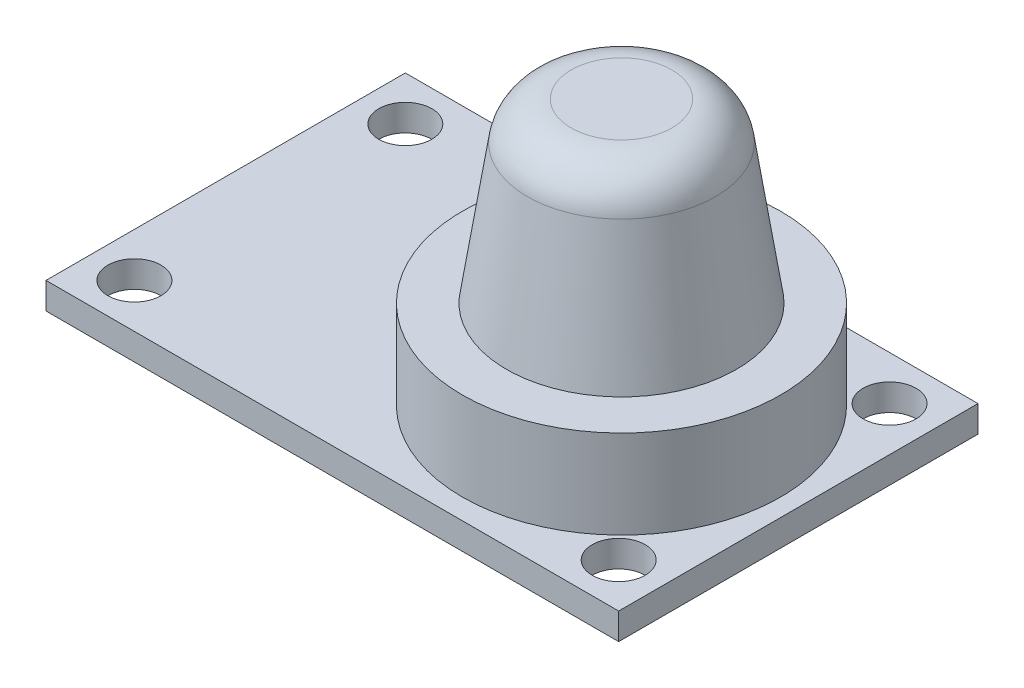
ISO-10303-21;
HEADER;
FILE_DESCRIPTION(('STEP AP214'),'2;1');
FILE_NAME('part.step','',(''),(''),'','','');
FILE_SCHEMA(('AUTOMOTIVE_DESIGN { 1 0 10303 214 1 1 1 1 }'));
ENDSEC;
DATA;
#1=APPLICATION_CONTEXT('core data for automotive mechanical design processes');
#2=APPLICATION_PROTOCOL_DEFINITION('international standard','automotive_design',2000,#1);
#3=PRODUCT_CONTEXT('',#1,'mechanical');
#4=PRODUCT('Part','Part','',(#3));
#5=PRODUCT_RELATED_PRODUCT_CATEGORY('part','',(#4));
#6=PRODUCT_DEFINITION_FORMATION('','',#4);
#7=PRODUCT_DEFINITION_CONTEXT('part definition',#1,'design');
#8=PRODUCT_DEFINITION('design','',#6,#7);
#9=PRODUCT_DEFINITION_SHAPE('','',#8);
#10=(LENGTH_UNIT() NAMED_UNIT(*) SI_UNIT(.MILLI.,.METRE.));
#11=(NAMED_UNIT(*) PLANE_ANGLE_UNIT() SI_UNIT($,.RADIAN.));
#12=(NAMED_UNIT(*) SI_UNIT($,.STERADIAN.) SOLID_ANGLE_UNIT());
#13=UNCERTAINTY_MEASURE_WITH_UNIT(LENGTH_MEASURE(1.E-05),#10,'distance_accuracy_value','');
#14=(GEOMETRIC_REPRESENTATION_CONTEXT(3) GLOBAL_UNCERTAINTY_ASSIGNED_CONTEXT((#13)) GLOBAL_UNIT_ASSIGNED_CONTEXT((#10,
#11,#12)) REPRESENTATION_CONTEXT('',''));
#15=CARTESIAN_POINT('',(0.,0.,0.));
#16=DIRECTION('',(0.,0.,1.));
#17=DIRECTION('',(1.,0.,0.));
#18=AXIS2_PLACEMENT_3D('',#15,#16,#17);
#19=CARTESIAN_POINT('',(0.,1.5,0.));
#20=DIRECTION('',(0.,1.,0.));
#21=DIRECTION('',(0.,0.,1.));
#22=AXIS2_PLACEMENT_3D('',#19,#20,#21);
#23=PLANE('',#22);
#24=CARTESIAN_POINT('',(6.19250000000001,1.5,0.));
#25=DIRECTION('',(0.,1.,0.));
#26=DIRECTION('',(0.,0.,1.));
#27=AXIS2_PLACEMENT_3D('',#24,#25,#26);
#28=CIRCLE('',#27,9.);
#29=CARTESIAN_POINT('',(6.19250000000001,1.5,9.));
#30=VERTEX_POINT('',#29);
#31=EDGE_CURVE('E11',#30,#30,#28,.T.);
#32=ORIENTED_EDGE('',*,*,#31,.F.);
#33=EDGE_LOOP('',(#32));
#34=FACE_BOUND('',#33,.T.);
#35=CARTESIAN_POINT('',(13.6925,1.5,7.66));
#36=DIRECTION('',(0.,1.,0.));
#37=DIRECTION('',(0.,0.,1.));
#38=AXIS2_PLACEMENT_3D('',#35,#36,#37);
#39=CIRCLE('',#38,1.5);
#40=CARTESIAN_POINT('',(13.6925,1.5,9.16));
#41=VERTEX_POINT('',#40);
#42=EDGE_CURVE('E124',#41,#41,#39,.T.);
#43=ORIENTED_EDGE('',*,*,#42,.F.);
#44=EDGE_LOOP('',(#43));
#45=FACE_BOUND('',#44,.T.);
#46=CARTESIAN_POINT('',(-13.6925,1.5,-7.66));
#47=DIRECTION('',(0.,1.,0.));
#48=DIRECTION('',(0.,0.,1.));
#49=AXIS2_PLACEMENT_3D('',#46,#47,#48);
#50=CIRCLE('',#49,1.5);
#51=CARTESIAN_POINT('',(-13.6925,1.5,-6.16));
#52=VERTEX_POINT('',#51);
#53=EDGE_CURVE('E103',#52,#52,#50,.T.);
#54=ORIENTED_EDGE('',*,*,#53,.F.);
#55=EDGE_LOOP('',(#54));
#56=FACE_BOUND('',#55,.T.);
#57=DIRECTION('',(0.,0.,-1.));
#58=VECTOR('',#57,1.);
#59=CARTESIAN_POINT('',(16.1925,1.5,-10.16));
#60=LINE('',#59,#58);
#61=CARTESIAN_POINT('',(16.1925,1.5,10.16));
#62=VERTEX_POINT('',#61);
#63=CARTESIAN_POINT('',(16.1925,1.5,-10.16));
#64=VERTEX_POINT('',#63);
#65=EDGE_CURVE('E87',#62,#64,#60,.T.);
#66=ORIENTED_EDGE('',*,*,#65,.T.);
#67=DIRECTION('',(-1.,0.,0.));
#68=VECTOR('',#67,1.);
#69=CARTESIAN_POINT('',(-16.1925,1.5,-10.16));
#70=LINE('',#69,#68);
#71=CARTESIAN_POINT('',(-16.1925,1.5,-10.16));
#72=VERTEX_POINT('',#71);
#73=EDGE_CURVE('E82',#64,#72,#70,.T.);
#74=ORIENTED_EDGE('',*,*,#73,.T.);
#75=DIRECTION('',(0.,0.,1.));
#76=VECTOR('',#75,1.);
#77=CARTESIAN_POINT('',(-16.1925,1.5,-10.16));
#78=LINE('',#77,#76);
#79=CARTESIAN_POINT('',(-16.1925,1.5,10.16));
#80=VERTEX_POINT('',#79);
#81=EDGE_CURVE('E85',#72,#80,#78,.T.);
#82=ORIENTED_EDGE('',*,*,#81,.T.);
#83=DIRECTION('',(1.,0.,0.));
#84=VECTOR('',#83,1.);
#85=CARTESIAN_POINT('',(-16.1925,1.5,10.16));
#86=LINE('',#85,#84);
#87=EDGE_CURVE('E51',#80,#62,#86,.T.);
#88=ORIENTED_EDGE('',*,*,#87,.T.);
#89=EDGE_LOOP('',(#66,#74,#82,#88));
#90=FACE_BOUND('',#89,.T.);
#91=CARTESIAN_POINT('',(13.6925,1.5,-7.66));
#92=DIRECTION('',(0.,1.,0.));
#93=DIRECTION('',(0.,0.,-1.));
#94=AXIS2_PLACEMENT_3D('',#91,#92,#93);
#95=CIRCLE('',#94,1.5);
#96=CARTESIAN_POINT('',(13.6925,1.5,-9.16));
#97=VERTEX_POINT('',#96);
#98=EDGE_CURVE('E118',#97,#97,#95,.T.);
#99=ORIENTED_EDGE('',*,*,#98,.F.);
#100=EDGE_LOOP('',(#99));
#101=FACE_BOUND('',#100,.T.);
#102=CARTESIAN_POINT('',(-13.6925,1.5,7.66));
#103=DIRECTION('',(0.,1.,0.));
#104=DIRECTION('',(0.,0.,-1.));
#105=AXIS2_PLACEMENT_3D('',#102,#103,#104);
#106=CIRCLE('',#105,1.5);
#107=CARTESIAN_POINT('',(-13.6925,1.5,6.16));
#108=VERTEX_POINT('',#107);
#109=EDGE_CURVE('E130',#108,#108,#106,.T.);
#110=ORIENTED_EDGE('',*,*,#109,.F.);
#111=EDGE_LOOP('',(#110));
#112=FACE_BOUND('',#111,.T.);
#113=ADVANCED_FACE('F33',(#34,#45,#56,#90,#101,#112),#23,.T.);
#114=CARTESIAN_POINT('',(0.,0.,0.));
#115=DIRECTION('',(0.,1.,0.));
#116=DIRECTION('',(0.,0.,1.));
#117=AXIS2_PLACEMENT_3D('',#114,#115,#116);
#118=PLANE('',#117);
#119=DIRECTION('',(0.,0.,-1.));
#120=VECTOR('',#119,1.);
#121=CARTESIAN_POINT('',(16.1925,0.,-10.16));
#122=LINE('',#121,#120);
#123=CARTESIAN_POINT('',(16.1925,0.,10.16));
#124=VERTEX_POINT('',#123);
#125=CARTESIAN_POINT('',(16.1925,0.,-10.16));
#126=VERTEX_POINT('',#125);
#127=EDGE_CURVE('E100',#124,#126,#122,.T.);
#128=ORIENTED_EDGE('',*,*,#127,.F.);
#129=DIRECTION('',(1.,0.,0.));
#130=VECTOR('',#129,1.);
#131=CARTESIAN_POINT('',(-16.1925,0.,10.16));
#132=LINE('',#131,#130);
#133=CARTESIAN_POINT('',(-16.1925,0.,10.16));
#134=VERTEX_POINT('',#133);
#135=EDGE_CURVE('E74',#134,#124,#132,.T.);
#136=ORIENTED_EDGE('',*,*,#135,.F.);
#137=DIRECTION('',(0.,0.,1.));
#138=VECTOR('',#137,1.);
#139=CARTESIAN_POINT('',(-16.1925,0.,-10.16));
#140=LINE('',#139,#138);
#141=CARTESIAN_POINT('',(-16.1925,0.,-10.16));
#142=VERTEX_POINT('',#141);
#143=EDGE_CURVE('E68',#142,#134,#140,.T.);
#144=ORIENTED_EDGE('',*,*,#143,.F.);
#145=DIRECTION('',(-1.,0.,0.));
#146=VECTOR('',#145,1.);
#147=CARTESIAN_POINT('',(-16.1925,0.,-10.16));
#148=LINE('',#147,#146);
#149=EDGE_CURVE('E92',#126,#142,#148,.T.);
#150=ORIENTED_EDGE('',*,*,#149,.F.);
#151=EDGE_LOOP('',(#128,#136,#144,#150));
#152=FACE_BOUND('',#151,.T.);
#153=CARTESIAN_POINT('',(-13.6925,0.,-7.66));
#154=DIRECTION('',(0.,1.,0.));
#155=DIRECTION('',(0.,0.,1.));
#156=AXIS2_PLACEMENT_3D('',#153,#154,#155);
#157=CIRCLE('',#156,1.5);
#158=CARTESIAN_POINT('',(-13.6925,0.,-6.16));
#159=VERTEX_POINT('',#158);
#160=EDGE_CURVE('E115',#159,#159,#157,.T.);
#161=ORIENTED_EDGE('',*,*,#160,.T.);
#162=EDGE_LOOP('',(#161));
#163=FACE_BOUND('',#162,.T.);
#164=CARTESIAN_POINT('',(13.6925,0.,-7.66));
#165=DIRECTION('',(0.,1.,0.));
#166=DIRECTION('',(0.,0.,-1.));
#167=AXIS2_PLACEMENT_3D('',#164,#165,#166);
#168=CIRCLE('',#167,1.5);
#169=CARTESIAN_POINT('',(13.6925,0.,-9.16));
#170=VERTEX_POINT('',#169);
#171=EDGE_CURVE('E121',#170,#170,#168,.T.);
#172=ORIENTED_EDGE('',*,*,#171,.T.);
#173=EDGE_LOOP('',(#172));
#174=FACE_BOUND('',#173,.T.);
#175=CARTESIAN_POINT('',(13.6925,0.,7.66));
#176=DIRECTION('',(0.,1.,0.));
#177=DIRECTION('',(0.,0.,1.));
#178=AXIS2_PLACEMENT_3D('',#175,#176,#177);
#179=CIRCLE('',#178,1.5);
#180=CARTESIAN_POINT('',(13.6925,0.,9.16));
#181=VERTEX_POINT('',#180);
#182=EDGE_CURVE('E127',#181,#181,#179,.T.);
#183=ORIENTED_EDGE('',*,*,#182,.T.);
#184=EDGE_LOOP('',(#183));
#185=FACE_BOUND('',#184,.T.);
#186=CARTESIAN_POINT('',(-13.6925,0.,7.66));
#187=DIRECTION('',(0.,1.,0.));
#188=DIRECTION('',(0.,0.,-1.));
#189=AXIS2_PLACEMENT_3D('',#186,#187,#188);
#190=CIRCLE('',#189,1.5);
#191=CARTESIAN_POINT('',(-13.6925,0.,6.16));
#192=VERTEX_POINT('',#191);
#193=EDGE_CURVE('E133',#192,#192,#190,.T.);
#194=ORIENTED_EDGE('',*,*,#193,.T.);
#195=EDGE_LOOP('',(#194));
#196=FACE_BOUND('',#195,.T.);
#197=ADVANCED_FACE('F111',(#152,#163,#174,#185,#196),#118,.F.);
#198=CARTESIAN_POINT('',(16.1925,1.5,-10.16));
#199=DIRECTION('',(-1.,0.,0.));
#200=DIRECTION('',(0.,0.,1.));
#201=AXIS2_PLACEMENT_3D('',#198,#199,#200);
#202=PLANE('',#201);
#203=ORIENTED_EDGE('',*,*,#127,.T.);
#204=DIRECTION('',(0.,-1.,0.));
#205=VECTOR('',#204,1.);
#206=CARTESIAN_POINT('',(16.1925,1.5,-10.16));
#207=LINE('',#206,#205);
#208=EDGE_CURVE('E37',#64,#126,#207,.T.);
#209=ORIENTED_EDGE('',*,*,#208,.F.);
#210=ORIENTED_EDGE('',*,*,#65,.F.);
#211=DIRECTION('',(0.,-1.,0.));
#212=VECTOR('',#211,1.);
#213=CARTESIAN_POINT('',(16.1925,1.5,10.16));
#214=LINE('',#213,#212);
#215=EDGE_CURVE('E96',#62,#124,#214,.T.);
#216=ORIENTED_EDGE('',*,*,#215,.T.);
#217=EDGE_LOOP('',(#203,#209,#210,#216));
#218=FACE_BOUND('',#217,.T.);
#219=ADVANCED_FACE('F35',(#218),#202,.F.);
#220=CARTESIAN_POINT('',(-16.1925,1.5,-10.16));
#221=DIRECTION('',(0.,0.,1.));
#222=DIRECTION('',(1.,0.,0.));
#223=AXIS2_PLACEMENT_3D('',#220,#221,#222);
#224=PLANE('',#223);
#225=ORIENTED_EDGE('',*,*,#149,.T.);
#226=DIRECTION('',(0.,-1.,0.));
#227=VECTOR('',#226,1.);
#228=CARTESIAN_POINT('',(-16.1925,1.5,-10.16));
#229=LINE('',#228,#227);
#230=EDGE_CURVE('E90',#72,#142,#229,.T.);
#231=ORIENTED_EDGE('',*,*,#230,.F.);
#232=ORIENTED_EDGE('',*,*,#73,.F.);
#233=ORIENTED_EDGE('',*,*,#208,.T.);
#234=EDGE_LOOP('',(#225,#231,#232,#233));
#235=FACE_BOUND('',#234,.T.);
#236=ADVANCED_FACE('F91',(#235),#224,.F.);
#237=CARTESIAN_POINT('',(-16.1925,1.5,-10.16));
#238=DIRECTION('',(1.,0.,0.));
#239=DIRECTION('',(0.,0.,-1.));
#240=AXIS2_PLACEMENT_3D('',#237,#238,#239);
#241=PLANE('',#240);
#242=ORIENTED_EDGE('',*,*,#143,.T.);
#243=DIRECTION('',(0.,-1.,0.));
#244=VECTOR('',#243,1.);
#245=CARTESIAN_POINT('',(-16.1925,1.5,10.16));
#246=LINE('',#245,#244);
#247=EDGE_CURVE('E93',#80,#134,#246,.T.);
#248=ORIENTED_EDGE('',*,*,#247,.F.);
#249=ORIENTED_EDGE('',*,*,#81,.F.);
#250=ORIENTED_EDGE('',*,*,#230,.T.);
#251=EDGE_LOOP('',(#242,#248,#249,#250));
#252=FACE_BOUND('',#251,.T.);
#253=ADVANCED_FACE('F94',(#252),#241,.F.);
#254=CARTESIAN_POINT('',(-16.1925,1.5,10.16));
#255=DIRECTION('',(0.,0.,-1.));
#256=DIRECTION('',(-1.,0.,0.));
#257=AXIS2_PLACEMENT_3D('',#254,#255,#256);
#258=PLANE('',#257);
#259=ORIENTED_EDGE('',*,*,#135,.T.);
#260=ORIENTED_EDGE('',*,*,#215,.F.);
#261=ORIENTED_EDGE('',*,*,#87,.F.);
#262=ORIENTED_EDGE('',*,*,#247,.T.);
#263=EDGE_LOOP('',(#259,#260,#261,#262));
#264=FACE_BOUND('',#263,.T.);
#265=ADVANCED_FACE('F108',(#264),#258,.F.);
#266=CARTESIAN_POINT('',(-13.6925,1.5,-7.66));
#267=DIRECTION('',(0.,-1.,0.));
#268=DIRECTION('',(0.,0.,-1.));
#269=AXIS2_PLACEMENT_3D('',#266,#267,#268);
#270=CYLINDRICAL_SURFACE('',#269,1.5);
#271=ORIENTED_EDGE('',*,*,#53,.T.);
#272=EDGE_LOOP('',(#271));
#273=FACE_BOUND('',#272,.T.);
#274=ORIENTED_EDGE('',*,*,#160,.F.);
#275=EDGE_LOOP('',(#274));
#276=FACE_BOUND('',#275,.T.);
#277=ADVANCED_FACE('F175',(#273,#276),#270,.F.);
#278=CARTESIAN_POINT('',(13.6925,1.5,-7.66));
#279=DIRECTION('',(0.,-1.,0.));
#280=DIRECTION('',(0.,0.,-1.));
#281=AXIS2_PLACEMENT_3D('',#278,#279,#280);
#282=CYLINDRICAL_SURFACE('',#281,1.5);
#283=ORIENTED_EDGE('',*,*,#98,.T.);
#284=EDGE_LOOP('',(#283));
#285=FACE_BOUND('',#284,.T.);
#286=ORIENTED_EDGE('',*,*,#171,.F.);
#287=EDGE_LOOP('',(#286));
#288=FACE_BOUND('',#287,.T.);
#289=ADVANCED_FACE('F220',(#285,#288),#282,.F.);
#290=CARTESIAN_POINT('',(13.6925,1.5,7.66));
#291=DIRECTION('',(0.,-1.,0.));
#292=DIRECTION('',(0.,0.,-1.));
#293=AXIS2_PLACEMENT_3D('',#290,#291,#292);
#294=CYLINDRICAL_SURFACE('',#293,1.5);
#295=ORIENTED_EDGE('',*,*,#42,.T.);
#296=EDGE_LOOP('',(#295));
#297=FACE_BOUND('',#296,.T.);
#298=ORIENTED_EDGE('',*,*,#182,.F.);
#299=EDGE_LOOP('',(#298));
#300=FACE_BOUND('',#299,.T.);
#301=ADVANCED_FACE('F228',(#297,#300),#294,.F.);
#302=CARTESIAN_POINT('',(-13.6925,1.5,7.66));
#303=DIRECTION('',(0.,-1.,0.));
#304=DIRECTION('',(0.,0.,-1.));
#305=AXIS2_PLACEMENT_3D('',#302,#303,#304);
#306=CYLINDRICAL_SURFACE('',#305,1.5);
#307=ORIENTED_EDGE('',*,*,#109,.T.);
#308=EDGE_LOOP('',(#307));
#309=FACE_BOUND('',#308,.T.);
#310=ORIENTED_EDGE('',*,*,#193,.F.);
#311=EDGE_LOOP('',(#310));
#312=FACE_BOUND('',#311,.T.);
#313=ADVANCED_FACE('F236',(#309,#312),#306,.F.);
#314=CARTESIAN_POINT('',(6.19250000000001,6.5,0.));
#315=DIRECTION('',(0.,-1.,0.));
#316=DIRECTION('',(0.,0.,-1.));
#317=AXIS2_PLACEMENT_3D('',#314,#315,#316);
#318=CYLINDRICAL_SURFACE('',#317,9.);
#319=CARTESIAN_POINT('',(6.19250000000001,6.5,0.));
#320=DIRECTION('',(0.,1.,0.));
#321=DIRECTION('',(0.,0.,1.));
#322=AXIS2_PLACEMENT_3D('',#319,#320,#321);
#323=CIRCLE('',#322,9.);
#324=CARTESIAN_POINT('',(6.19250000000001,6.5,9.));
#325=VERTEX_POINT('',#324);
#326=EDGE_CURVE('E136',#325,#325,#323,.T.);
#327=ORIENTED_EDGE('',*,*,#326,.F.);
#328=EDGE_LOOP('',(#327));
#329=FACE_BOUND('',#328,.T.);
#330=ORIENTED_EDGE('',*,*,#31,.T.);
#331=EDGE_LOOP('',(#330));
#332=FACE_BOUND('',#331,.T.);
#333=ADVANCED_FACE('F245',(#329,#332),#318,.T.);
#334=CARTESIAN_POINT('',(6.19250000000001,6.5,0.));
#335=DIRECTION('',(0.,1.,0.));
#336=DIRECTION('',(0.,0.,1.));
#337=AXIS2_PLACEMENT_3D('',#334,#335,#336);
#338=PLANE('',#337);
#339=CARTESIAN_POINT('',(6.19250000000001,6.5,0.));
#340=DIRECTION('',(0.,-1.,0.));
#341=DIRECTION('',(0.,0.,-1.));
#342=AXIS2_PLACEMENT_3D('',#339,#340,#341);
#343=CIRCLE('',#342,6.5);
#344=CARTESIAN_POINT('',(6.19250000000001,6.5,-6.5));
#345=VERTEX_POINT('',#344);
#346=EDGE_CURVE('E147',#345,#345,#343,.T.);
#347=ORIENTED_EDGE('',*,*,#346,.T.);
#348=EDGE_LOOP('',(#347));
#349=FACE_BOUND('',#348,.T.);
#350=ORIENTED_EDGE('',*,*,#326,.T.);
#351=EDGE_LOOP('',(#350));
#352=FACE_BOUND('',#351,.T.);
#353=ADVANCED_FACE('F151',(#349,#352),#338,.T.);
#354=CARTESIAN_POINT('',(6.19250000000001,16.5,0.));
#355=DIRECTION('',(0.,1.,0.));
#356=DIRECTION('',(0.,0.,1.));
#357=AXIS2_PLACEMENT_3D('',#354,#355,#356);
#358=PLANE('',#357);
#359=CARTESIAN_POINT('',(6.19250000000001,16.5,0.));
#360=DIRECTION('',(0.,-1.,0.));
#361=DIRECTION('',(0.,0.,-1.));
#362=AXIS2_PLACEMENT_3D('',#359,#360,#361);
#363=CIRCLE('',#362,2.8470314479804);
#364=CARTESIAN_POINT('',(6.19250000000001,16.5,-2.8470314479804));
#365=VERTEX_POINT('',#364);
#366=EDGE_CURVE('E141',#365,#365,#363,.T.);
#367=ORIENTED_EDGE('',*,*,#366,.F.);
#368=EDGE_LOOP('',(#367));
#369=FACE_BOUND('',#368,.T.);
#370=ADVANCED_FACE('F162',(#369),#358,.T.);
#371=CARTESIAN_POINT('',(6.19250000000001,14.,0.));
#372=DIRECTION('',(0.,-1.,0.));
#373=DIRECTION('',(0.,0.,-1.));
#374=AXIS2_PLACEMENT_3D('',#371,#372,#373);
#375=TOROIDAL_SURFACE('',#374,2.84703144798041,2.5);
#376=ORIENTED_EDGE('',*,*,#366,.T.);
#377=EDGE_LOOP('',(#376));
#378=FACE_BOUND('',#377,.T.);
#379=CARTESIAN_POINT('',(6.19250000000001,14.3708511323256,0.));
#380=DIRECTION('',(0.,-1.,0.));
#381=DIRECTION('',(0.,0.,-1.));
#382=AXIS2_PLACEMENT_3D('',#379,#380,#381);
#383=CIRCLE('',#382,5.31937233015116);
#384=CARTESIAN_POINT('',(6.19250000000001,14.3708511323256,-5.31937233015116));
#385=VERTEX_POINT('',#384);
#386=EDGE_CURVE('E144',#385,#385,#383,.T.);
#387=ORIENTED_EDGE('',*,*,#386,.F.);
#388=EDGE_LOOP('',(#387));
#389=FACE_BOUND('',#388,.T.);
#390=ADVANCED_FACE('F156',(#378,#389),#375,.T.);
#391=CARTESIAN_POINT('',(6.19250000000001,6.5,0.));
#392=DIRECTION('',(0.,-1.,0.));
#393=DIRECTION('',(0.,0.,-1.));
#394=AXIS2_PLACEMENT_3D('',#391,#392,#393);
#395=CONICAL_SURFACE('',#394,6.5,0.148889947609497);
#396=ORIENTED_EDGE('',*,*,#386,.T.);
#397=EDGE_LOOP('',(#396));
#398=FACE_BOUND('',#397,.T.);
#399=ORIENTED_EDGE('',*,*,#346,.F.);
#400=EDGE_LOOP('',(#399));
#401=FACE_BOUND('',#400,.T.);
#402=ADVANCED_FACE('F154',(#398,#401),#395,.T.);
#403=CLOSED_SHELL('',(#113,#197,#219,#236,#253,#265,#277,#289,#301,#313,#333,#353,#370,#390,#402));
#404=MANIFOLD_SOLID_BREP('B2',#403);
#405=ADVANCED_BREP_SHAPE_REPRESENTATION('',(#18,#404),#14);
#406=SHAPE_DEFINITION_REPRESENTATION(#9,#405);
ENDSEC;
END-ISO-10303-21;
